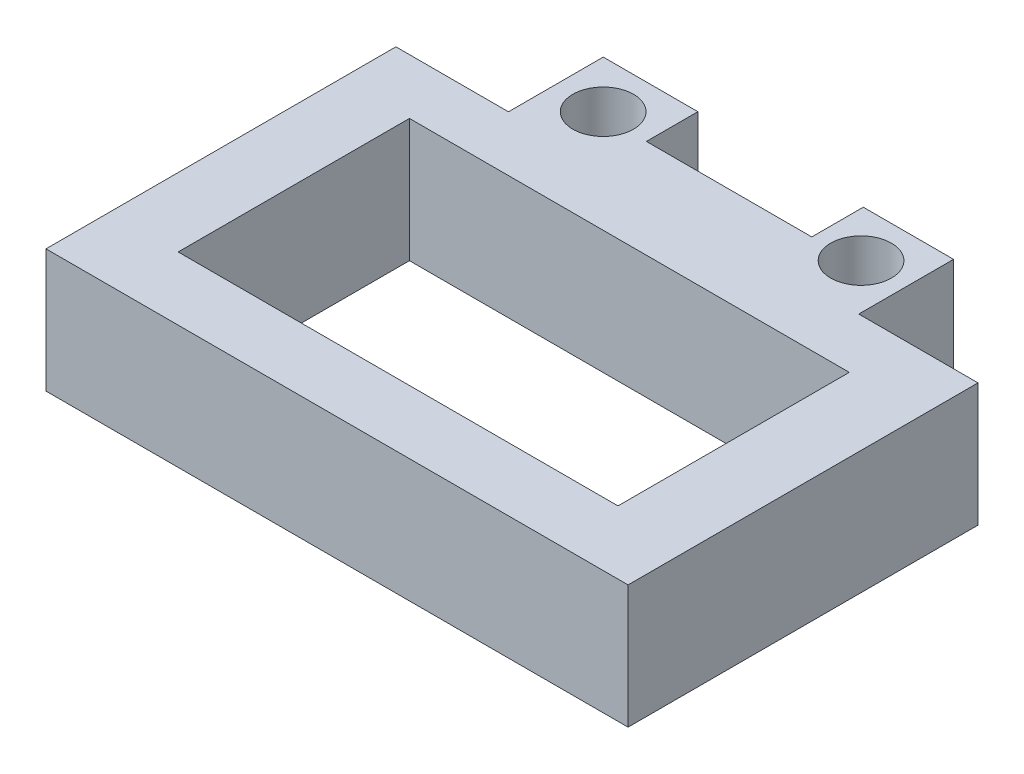
ISO-10303-21;
HEADER;
FILE_DESCRIPTION(('STEP AP214'),'2;1');
FILE_NAME('part.step','',(''),(''),'','','');
FILE_SCHEMA(('AUTOMOTIVE_DESIGN { 1 0 10303 214 1 1 1 1 }'));
ENDSEC;
DATA;
#1=APPLICATION_CONTEXT('core data for automotive mechanical design processes');
#2=APPLICATION_PROTOCOL_DEFINITION('international standard','automotive_design',2000,#1);
#3=PRODUCT_CONTEXT('',#1,'mechanical');
#4=PRODUCT('Part','Part','',(#3));
#5=PRODUCT_RELATED_PRODUCT_CATEGORY('part','',(#4));
#6=PRODUCT_DEFINITION_FORMATION('','',#4);
#7=PRODUCT_DEFINITION_CONTEXT('part definition',#1,'design');
#8=PRODUCT_DEFINITION('design','',#6,#7);
#9=PRODUCT_DEFINITION_SHAPE('','',#8);
#10=(LENGTH_UNIT() NAMED_UNIT(*) SI_UNIT(.MILLI.,.METRE.));
#11=(NAMED_UNIT(*) PLANE_ANGLE_UNIT() SI_UNIT($,.RADIAN.));
#12=(NAMED_UNIT(*) SI_UNIT($,.STERADIAN.) SOLID_ANGLE_UNIT());
#13=UNCERTAINTY_MEASURE_WITH_UNIT(LENGTH_MEASURE(1.E-05),#10,'distance_accuracy_value','');
#14=(GEOMETRIC_REPRESENTATION_CONTEXT(3) GLOBAL_UNCERTAINTY_ASSIGNED_CONTEXT((#13)) GLOBAL_UNIT_ASSIGNED_CONTEXT((#10,
#11,#12)) REPRESENTATION_CONTEXT('',''));
#15=CARTESIAN_POINT('',(0.,0.,0.));
#16=DIRECTION('',(0.,0.,1.));
#17=DIRECTION('',(1.,0.,0.));
#18=AXIS2_PLACEMENT_3D('',#15,#16,#17);
#19=CARTESIAN_POINT('',(0.,6.5,-27.7029443593856));
#20=DIRECTION('',(0.,0.,-1.));
#21=DIRECTION('',(-1.,0.,0.));
#22=AXIS2_PLACEMENT_3D('',#19,#20,#21);
#23=PLANE('',#22);
#24=DIRECTION('',(1.,0.,0.));
#25=VECTOR('',#24,1.);
#26=CARTESIAN_POINT('',(0.,0.,-27.7029443593856));
#27=LINE('',#26,#25);
#28=CARTESIAN_POINT('',(15.9084062557458,0.,-27.7029443593856));
#29=VERTEX_POINT('',#28);
#30=CARTESIAN_POINT('',(39.1084062557458,0.,-27.7029443593856));
#31=VERTEX_POINT('',#30);
#32=EDGE_CURVE('E249',#29,#31,#27,.T.);
#33=ORIENTED_EDGE('',*,*,#32,.T.);
#34=DIRECTION('',(0.,-1.,0.));
#35=VECTOR('',#34,1.);
#36=CARTESIAN_POINT('',(39.1084062557458,6.5,-27.7029443593856));
#37=LINE('',#36,#35);
#38=CARTESIAN_POINT('',(39.1084062557458,6.5,-27.7029443593856));
#39=VERTEX_POINT('',#38);
#40=EDGE_CURVE('E11',#39,#31,#37,.T.);
#41=ORIENTED_EDGE('',*,*,#40,.F.);
#42=DIRECTION('',(1.,0.,0.));
#43=VECTOR('',#42,1.);
#44=CARTESIAN_POINT('',(0.,6.5,-27.7029443593856));
#45=LINE('',#44,#43);
#46=CARTESIAN_POINT('',(15.9084062557458,6.5,-27.7029443593856));
#47=VERTEX_POINT('',#46);
#48=EDGE_CURVE('E176',#47,#39,#45,.T.);
#49=ORIENTED_EDGE('',*,*,#48,.F.);
#50=DIRECTION('',(0.,-1.,0.));
#51=VECTOR('',#50,1.);
#52=CARTESIAN_POINT('',(15.9084062557458,6.5,-27.7029443593856));
#53=LINE('',#52,#51);
#54=EDGE_CURVE('E67',#47,#29,#53,.T.);
#55=ORIENTED_EDGE('',*,*,#54,.T.);
#56=EDGE_LOOP('',(#33,#41,#49,#55));
#57=FACE_BOUND('',#56,.T.);
#58=ADVANCED_FACE('F47',(#57),#23,.F.);
#59=CARTESIAN_POINT('',(39.1084062557458,6.5,0.));
#60=DIRECTION('',(1.,0.,0.));
#61=DIRECTION('',(0.,0.,-1.));
#62=AXIS2_PLACEMENT_3D('',#59,#60,#61);
#63=PLANE('',#62);
#64=DIRECTION('',(0.,0.,1.));
#65=VECTOR('',#64,1.);
#66=CARTESIAN_POINT('',(39.1084062557458,0.,0.));
#67=LINE('',#66,#65);
#68=CARTESIAN_POINT('',(39.1084062557458,0.,-15.5029443593856));
#69=VERTEX_POINT('',#68);
#70=EDGE_CURVE('E183',#31,#69,#67,.T.);
#71=ORIENTED_EDGE('',*,*,#70,.T.);
#72=DIRECTION('',(0.,-1.,0.));
#73=VECTOR('',#72,1.);
#74=CARTESIAN_POINT('',(39.1084062557458,6.5,-15.5029443593856));
#75=LINE('',#74,#73);
#76=CARTESIAN_POINT('',(39.1084062557458,6.5,-15.5029443593856));
#77=VERTEX_POINT('',#76);
#78=EDGE_CURVE('E58',#77,#69,#75,.T.);
#79=ORIENTED_EDGE('',*,*,#78,.F.);
#80=DIRECTION('',(0.,0.,1.));
#81=VECTOR('',#80,1.);
#82=CARTESIAN_POINT('',(39.1084062557458,6.5,0.));
#83=LINE('',#82,#81);
#84=EDGE_CURVE('E169',#39,#77,#83,.T.);
#85=ORIENTED_EDGE('',*,*,#84,.F.);
#86=ORIENTED_EDGE('',*,*,#40,.T.);
#87=EDGE_LOOP('',(#71,#79,#85,#86));
#88=FACE_BOUND('',#87,.T.);
#89=ADVANCED_FACE('F182',(#88),#63,.F.);
#90=CARTESIAN_POINT('',(0.,6.5,-15.5029443593856));
#91=DIRECTION('',(0.,0.,-1.));
#92=DIRECTION('',(-1.,0.,0.));
#93=AXIS2_PLACEMENT_3D('',#90,#91,#92);
#94=PLANE('',#93);
#95=DIRECTION('',(1.,0.,0.));
#96=VECTOR('',#95,1.);
#97=CARTESIAN_POINT('',(0.,0.,-15.5029443593856));
#98=LINE('',#97,#96);
#99=CARTESIAN_POINT('',(15.9084062557458,0.,-15.5029443593856));
#100=VERTEX_POINT('',#99);
#101=EDGE_CURVE('E254',#100,#69,#98,.T.);
#102=ORIENTED_EDGE('',*,*,#101,.F.);
#103=DIRECTION('',(0.,-1.,0.));
#104=VECTOR('',#103,1.);
#105=CARTESIAN_POINT('',(15.9084062557458,6.5,-15.5029443593856));
#106=LINE('',#105,#104);
#107=CARTESIAN_POINT('',(15.9084062557458,6.5,-15.5029443593856));
#108=VERTEX_POINT('',#107);
#109=EDGE_CURVE('E117',#108,#100,#106,.T.);
#110=ORIENTED_EDGE('',*,*,#109,.F.);
#111=DIRECTION('',(1.,0.,0.));
#112=VECTOR('',#111,1.);
#113=CARTESIAN_POINT('',(0.,6.5,-15.5029443593856));
#114=LINE('',#113,#112);
#115=EDGE_CURVE('E175',#108,#77,#114,.T.);
#116=ORIENTED_EDGE('',*,*,#115,.T.);
#117=ORIENTED_EDGE('',*,*,#78,.T.);
#118=EDGE_LOOP('',(#102,#110,#116,#117));
#119=FACE_BOUND('',#118,.T.);
#120=ADVANCED_FACE('F188',(#119),#94,.T.);
#121=CARTESIAN_POINT('',(42.9837060254586,6.5,0.));
#122=DIRECTION('',(1.,0.,0.));
#123=DIRECTION('',(0.,0.,-1.));
#124=AXIS2_PLACEMENT_3D('',#121,#122,#123);
#125=PLANE('',#124);
#126=DIRECTION('',(0.,0.,1.));
#127=VECTOR('',#126,1.);
#128=CARTESIAN_POINT('',(42.9837060254586,0.,0.));
#129=LINE('',#128,#127);
#130=CARTESIAN_POINT('',(42.9837060254586,0.,-30.6169789102809));
#131=VERTEX_POINT('',#130);
#132=CARTESIAN_POINT('',(42.9837060254586,0.,-12.1598904694109));
#133=VERTEX_POINT('',#132);
#134=EDGE_CURVE('E205',#131,#133,#129,.T.);
#135=ORIENTED_EDGE('',*,*,#134,.F.);
#136=DIRECTION('',(0.,-1.,0.));
#137=VECTOR('',#136,1.);
#138=CARTESIAN_POINT('',(42.9837060254586,6.5,-30.6169789102809));
#139=LINE('',#138,#137);
#140=CARTESIAN_POINT('',(42.9837060254586,6.5,-30.6169789102809));
#141=VERTEX_POINT('',#140);
#142=EDGE_CURVE('E51',#141,#131,#139,.T.);
#143=ORIENTED_EDGE('',*,*,#142,.F.);
#144=DIRECTION('',(0.,0.,1.));
#145=VECTOR('',#144,1.);
#146=CARTESIAN_POINT('',(42.9837060254586,6.5,0.));
#147=LINE('',#146,#145);
#148=CARTESIAN_POINT('',(42.9837060254586,6.5,-12.1598904694109));
#149=VERTEX_POINT('',#148);
#150=EDGE_CURVE('E269',#141,#149,#147,.T.);
#151=ORIENTED_EDGE('',*,*,#150,.T.);
#152=DIRECTION('',(0.,-1.,0.));
#153=VECTOR('',#152,1.);
#154=CARTESIAN_POINT('',(42.9837060254586,6.5,-12.1598904694109));
#155=LINE('',#154,#153);
#156=EDGE_CURVE('E204',#149,#133,#155,.T.);
#157=ORIENTED_EDGE('',*,*,#156,.T.);
#158=EDGE_LOOP('',(#135,#143,#151,#157));
#159=FACE_BOUND('',#158,.T.);
#160=ADVANCED_FACE('F49',(#159),#125,.T.);
#161=CARTESIAN_POINT('',(0.,6.5,-30.6169789102809));
#162=DIRECTION('',(0.,0.,-1.));
#163=DIRECTION('',(-1.,0.,0.));
#164=AXIS2_PLACEMENT_3D('',#161,#162,#163);
#165=PLANE('',#164);
#166=DIRECTION('',(1.,0.,0.));
#167=VECTOR('',#166,1.);
#168=CARTESIAN_POINT('',(0.,0.,-30.6169789102809));
#169=LINE('',#168,#167);
#170=CARTESIAN_POINT('',(36.6952804265742,0.,-30.6169789102809));
#171=VERTEX_POINT('',#170);
#172=EDGE_CURVE('E209',#171,#131,#169,.T.);
#173=ORIENTED_EDGE('',*,*,#172,.F.);
#174=DIRECTION('',(0.,-1.,0.));
#175=VECTOR('',#174,1.);
#176=CARTESIAN_POINT('',(36.6952804265742,6.5,-30.6169789102809));
#177=LINE('',#176,#175);
#178=CARTESIAN_POINT('',(36.6952804265742,6.5,-30.6169789102809));
#179=VERTEX_POINT('',#178);
#180=EDGE_CURVE('E303',#179,#171,#177,.T.);
#181=ORIENTED_EDGE('',*,*,#180,.F.);
#182=DIRECTION('',(1.,0.,0.));
#183=VECTOR('',#182,1.);
#184=CARTESIAN_POINT('',(0.,6.5,-30.6169789102809));
#185=LINE('',#184,#183);
#186=EDGE_CURVE('E314',#179,#141,#185,.T.);
#187=ORIENTED_EDGE('',*,*,#186,.T.);
#188=ORIENTED_EDGE('',*,*,#142,.T.);
#189=EDGE_LOOP('',(#173,#181,#187,#188));
#190=FACE_BOUND('',#189,.T.);
#191=ADVANCED_FACE('F312',(#190),#165,.T.);
#192=CARTESIAN_POINT('',(36.6952804265742,6.5,0.));
#193=DIRECTION('',(1.,0.,0.));
#194=DIRECTION('',(0.,0.,-1.));
#195=AXIS2_PLACEMENT_3D('',#192,#193,#194);
#196=PLANE('',#195);
#197=DIRECTION('',(0.,0.,1.));
#198=VECTOR('',#197,1.);
#199=CARTESIAN_POINT('',(36.6952804265742,0.,0.));
#200=LINE('',#199,#198);
#201=CARTESIAN_POINT('',(36.6952804265742,0.,-35.6169789102809));
#202=VERTEX_POINT('',#201);
#203=EDGE_CURVE('E213',#202,#171,#200,.T.);
#204=ORIENTED_EDGE('',*,*,#203,.F.);
#205=DIRECTION('',(0.,-1.,0.));
#206=VECTOR('',#205,1.);
#207=CARTESIAN_POINT('',(36.6952804265742,6.5,-35.6169789102809));
#208=LINE('',#207,#206);
#209=CARTESIAN_POINT('',(36.6952804265742,6.5,-35.6169789102809));
#210=VERTEX_POINT('',#209);
#211=EDGE_CURVE('E301',#210,#202,#208,.T.);
#212=ORIENTED_EDGE('',*,*,#211,.F.);
#213=DIRECTION('',(0.,0.,1.));
#214=VECTOR('',#213,1.);
#215=CARTESIAN_POINT('',(36.6952804265742,6.5,0.));
#216=LINE('',#215,#214);
#217=EDGE_CURVE('E323',#210,#179,#216,.T.);
#218=ORIENTED_EDGE('',*,*,#217,.T.);
#219=ORIENTED_EDGE('',*,*,#180,.T.);
#220=EDGE_LOOP('',(#204,#212,#218,#219));
#221=FACE_BOUND('',#220,.T.);
#222=ADVANCED_FACE('F321',(#221),#196,.T.);
#223=CARTESIAN_POINT('',(0.,6.5,-35.6169789102809));
#224=DIRECTION('',(0.,0.,-1.));
#225=DIRECTION('',(-1.,0.,0.));
#226=AXIS2_PLACEMENT_3D('',#223,#224,#225);
#227=PLANE('',#226);
#228=DIRECTION('',(1.,0.,0.));
#229=VECTOR('',#228,1.);
#230=CARTESIAN_POINT('',(0.,0.,-35.6169789102809));
#231=LINE('',#230,#229);
#232=CARTESIAN_POINT('',(31.9329508926292,0.,-35.6169789102809));
#233=VERTEX_POINT('',#232);
#234=EDGE_CURVE('E218',#233,#202,#231,.T.);
#235=ORIENTED_EDGE('',*,*,#234,.F.);
#236=DIRECTION('',(0.,-1.,0.));
#237=VECTOR('',#236,1.);
#238=CARTESIAN_POINT('',(31.9329508926292,6.5,-35.6169789102809));
#239=LINE('',#238,#237);
#240=CARTESIAN_POINT('',(31.9329508926292,6.5,-35.6169789102809));
#241=VERTEX_POINT('',#240);
#242=EDGE_CURVE('E298',#241,#233,#239,.T.);
#243=ORIENTED_EDGE('',*,*,#242,.F.);
#244=DIRECTION('',(1.,0.,0.));
#245=VECTOR('',#244,1.);
#246=CARTESIAN_POINT('',(0.,6.5,-35.6169789102809));
#247=LINE('',#246,#245);
#248=EDGE_CURVE('E329',#241,#210,#247,.T.);
#249=ORIENTED_EDGE('',*,*,#248,.T.);
#250=ORIENTED_EDGE('',*,*,#211,.T.);
#251=EDGE_LOOP('',(#235,#243,#249,#250));
#252=FACE_BOUND('',#251,.T.);
#253=ADVANCED_FACE('F333',(#252),#227,.T.);
#254=CARTESIAN_POINT('',(31.9329508926292,6.5,0.));
#255=DIRECTION('',(-1.,0.,0.));
#256=DIRECTION('',(0.,0.,1.));
#257=AXIS2_PLACEMENT_3D('',#254,#255,#256);
#258=PLANE('',#257);
#259=DIRECTION('',(0.,0.,-1.));
#260=VECTOR('',#259,1.);
#261=CARTESIAN_POINT('',(31.9329508926292,0.,0.));
#262=LINE('',#261,#260);
#263=CARTESIAN_POINT('',(31.9329508926292,0.,-32.9001041007174));
#264=VERTEX_POINT('',#263);
#265=EDGE_CURVE('E222',#264,#233,#262,.T.);
#266=ORIENTED_EDGE('',*,*,#265,.F.);
#267=DIRECTION('',(0.,-1.,0.));
#268=VECTOR('',#267,1.);
#269=CARTESIAN_POINT('',(31.9329508926292,6.5,-32.9001041007174));
#270=LINE('',#269,#268);
#271=CARTESIAN_POINT('',(31.9329508926292,6.5,-32.9001041007174));
#272=VERTEX_POINT('',#271);
#273=EDGE_CURVE('E295',#272,#264,#270,.T.);
#274=ORIENTED_EDGE('',*,*,#273,.F.);
#275=DIRECTION('',(0.,0.,-1.));
#276=VECTOR('',#275,1.);
#277=CARTESIAN_POINT('',(31.9329508926292,6.5,0.));
#278=LINE('',#277,#276);
#279=EDGE_CURVE('E335',#272,#241,#278,.T.);
#280=ORIENTED_EDGE('',*,*,#279,.T.);
#281=ORIENTED_EDGE('',*,*,#242,.T.);
#282=EDGE_LOOP('',(#266,#274,#280,#281));
#283=FACE_BOUND('',#282,.T.);
#284=ADVANCED_FACE('F400',(#283),#258,.T.);
#285=CARTESIAN_POINT('',(0.,6.5,-32.9001041007174));
#286=DIRECTION('',(0.,0.,-1.));
#287=DIRECTION('',(-1.,0.,0.));
#288=AXIS2_PLACEMENT_3D('',#285,#286,#287);
#289=PLANE('',#288);
#290=DIRECTION('',(1.,0.,0.));
#291=VECTOR('',#290,1.);
#292=CARTESIAN_POINT('',(0.,0.,-32.9001041007174));
#293=LINE('',#292,#291);
#294=CARTESIAN_POINT('',(23.2083631864421,0.,-32.9001041007174));
#295=VERTEX_POINT('',#294);
#296=EDGE_CURVE('E226',#295,#264,#293,.T.);
#297=ORIENTED_EDGE('',*,*,#296,.F.);
#298=DIRECTION('',(0.,-1.,0.));
#299=VECTOR('',#298,1.);
#300=CARTESIAN_POINT('',(23.2083631864421,6.5,-32.9001041007174));
#301=LINE('',#300,#299);
#302=CARTESIAN_POINT('',(23.2083631864421,6.5,-32.9001041007174));
#303=VERTEX_POINT('',#302);
#304=EDGE_CURVE('E292',#303,#295,#301,.T.);
#305=ORIENTED_EDGE('',*,*,#304,.F.);
#306=DIRECTION('',(1.,0.,0.));
#307=VECTOR('',#306,1.);
#308=CARTESIAN_POINT('',(0.,6.5,-32.9001041007174));
#309=LINE('',#308,#307);
#310=EDGE_CURVE('E338',#303,#272,#309,.T.);
#311=ORIENTED_EDGE('',*,*,#310,.T.);
#312=ORIENTED_EDGE('',*,*,#273,.T.);
#313=EDGE_LOOP('',(#297,#305,#311,#312));
#314=FACE_BOUND('',#313,.T.);
#315=ADVANCED_FACE('F397',(#314),#289,.T.);
#316=CARTESIAN_POINT('',(23.2083631864421,6.5,0.));
#317=DIRECTION('',(1.,0.,0.));
#318=DIRECTION('',(0.,0.,-1.));
#319=AXIS2_PLACEMENT_3D('',#316,#317,#318);
#320=PLANE('',#319);
#321=DIRECTION('',(0.,0.,1.));
#322=VECTOR('',#321,1.);
#323=CARTESIAN_POINT('',(23.2083631864421,0.,0.));
#324=LINE('',#323,#322);
#325=CARTESIAN_POINT('',(23.2083631864421,0.,-35.6169789102809));
#326=VERTEX_POINT('',#325);
#327=EDGE_CURVE('E230',#326,#295,#324,.T.);
#328=ORIENTED_EDGE('',*,*,#327,.F.);
#329=DIRECTION('',(0.,-1.,0.));
#330=VECTOR('',#329,1.);
#331=CARTESIAN_POINT('',(23.2083631864421,6.5,-35.6169789102809));
#332=LINE('',#331,#330);
#333=CARTESIAN_POINT('',(23.2083631864421,6.5,-35.6169789102809));
#334=VERTEX_POINT('',#333);
#335=EDGE_CURVE('E289',#334,#326,#332,.T.);
#336=ORIENTED_EDGE('',*,*,#335,.F.);
#337=DIRECTION('',(0.,0.,1.));
#338=VECTOR('',#337,1.);
#339=CARTESIAN_POINT('',(23.2083631864421,6.5,0.));
#340=LINE('',#339,#338);
#341=EDGE_CURVE('E345',#334,#303,#340,.T.);
#342=ORIENTED_EDGE('',*,*,#341,.T.);
#343=ORIENTED_EDGE('',*,*,#304,.T.);
#344=EDGE_LOOP('',(#328,#336,#342,#343));
#345=FACE_BOUND('',#344,.T.);
#346=ADVANCED_FACE('F393',(#345),#320,.T.);
#347=CARTESIAN_POINT('',(0.,6.5,-35.6169789102809));
#348=DIRECTION('',(0.,0.,-1.));
#349=DIRECTION('',(-1.,0.,0.));
#350=AXIS2_PLACEMENT_3D('',#347,#348,#349);
#351=PLANE('',#350);
#352=DIRECTION('',(1.,0.,0.));
#353=VECTOR('',#352,1.);
#354=CARTESIAN_POINT('',(0.,0.,-35.6169789102809));
#355=LINE('',#354,#353);
#356=CARTESIAN_POINT('',(18.2174418348678,0.,-35.6169789102809));
#357=VERTEX_POINT('',#356);
#358=EDGE_CURVE('E234',#357,#326,#355,.T.);
#359=ORIENTED_EDGE('',*,*,#358,.F.);
#360=DIRECTION('',(0.,-1.,0.));
#361=VECTOR('',#360,1.);
#362=CARTESIAN_POINT('',(18.2174418348678,6.5,-35.6169789102809));
#363=LINE('',#362,#361);
#364=CARTESIAN_POINT('',(18.2174418348678,6.5,-35.6169789102809));
#365=VERTEX_POINT('',#364);
#366=EDGE_CURVE('E286',#365,#357,#363,.T.);
#367=ORIENTED_EDGE('',*,*,#366,.F.);
#368=DIRECTION('',(1.,0.,0.));
#369=VECTOR('',#368,1.);
#370=CARTESIAN_POINT('',(0.,6.5,-35.6169789102809));
#371=LINE('',#370,#369);
#372=EDGE_CURVE('E349',#365,#334,#371,.T.);
#373=ORIENTED_EDGE('',*,*,#372,.T.);
#374=ORIENTED_EDGE('',*,*,#335,.T.);
#375=EDGE_LOOP('',(#359,#367,#373,#374));
#376=FACE_BOUND('',#375,.T.);
#377=ADVANCED_FACE('F388',(#376),#351,.T.);
#378=CARTESIAN_POINT('',(18.2174418348678,6.5,0.));
#379=DIRECTION('',(1.,0.,0.));
#380=DIRECTION('',(0.,0.,-1.));
#381=AXIS2_PLACEMENT_3D('',#378,#379,#380);
#382=PLANE('',#381);
#383=DIRECTION('',(0.,0.,1.));
#384=VECTOR('',#383,1.);
#385=CARTESIAN_POINT('',(18.2174418348678,0.,0.));
#386=LINE('',#385,#384);
#387=CARTESIAN_POINT('',(18.2174418348678,0.,-30.6169789102809));
#388=VERTEX_POINT('',#387);
#389=EDGE_CURVE('E238',#357,#388,#386,.T.);
#390=ORIENTED_EDGE('',*,*,#389,.T.);
#391=DIRECTION('',(0.,-1.,0.));
#392=VECTOR('',#391,1.);
#393=CARTESIAN_POINT('',(18.2174418348678,6.5,-30.6169789102809));
#394=LINE('',#393,#392);
#395=CARTESIAN_POINT('',(18.2174418348678,6.5,-30.6169789102809));
#396=VERTEX_POINT('',#395);
#397=EDGE_CURVE('E283',#396,#388,#394,.T.);
#398=ORIENTED_EDGE('',*,*,#397,.F.);
#399=DIRECTION('',(0.,0.,1.));
#400=VECTOR('',#399,1.);
#401=CARTESIAN_POINT('',(18.2174418348678,6.5,0.));
#402=LINE('',#401,#400);
#403=EDGE_CURVE('E353',#365,#396,#402,.T.);
#404=ORIENTED_EDGE('',*,*,#403,.F.);
#405=ORIENTED_EDGE('',*,*,#366,.T.);
#406=EDGE_LOOP('',(#390,#398,#404,#405));
#407=FACE_BOUND('',#406,.T.);
#408=ADVANCED_FACE('F385',(#407),#382,.F.);
#409=CARTESIAN_POINT('',(12.2810376549901,0.,-30.6169789102809));
#410=VERTEX_POINT('',#409);
#411=EDGE_CURVE('E214',#410,#388,#169,.T.);
#412=ORIENTED_EDGE('',*,*,#411,.F.);
#413=DIRECTION('',(0.,-1.,0.));
#414=VECTOR('',#413,1.);
#415=CARTESIAN_POINT('',(12.2810376549901,6.5,-30.6169789102809));
#416=LINE('',#415,#414);
#417=CARTESIAN_POINT('',(12.2810376549901,6.5,-30.6169789102809));
#418=VERTEX_POINT('',#417);
#419=EDGE_CURVE('E280',#418,#410,#416,.T.);
#420=ORIENTED_EDGE('',*,*,#419,.F.);
#421=EDGE_CURVE('E356',#418,#396,#185,.T.);
#422=ORIENTED_EDGE('',*,*,#421,.T.);
#423=ORIENTED_EDGE('',*,*,#397,.T.);
#424=EDGE_LOOP('',(#412,#420,#422,#423));
#425=FACE_BOUND('',#424,.T.);
#426=ADVANCED_FACE('F380',(#425),#165,.T.);
#427=CARTESIAN_POINT('',(12.2810376549901,6.5,0.));
#428=DIRECTION('',(1.,0.,0.));
#429=DIRECTION('',(0.,0.,-1.));
#430=AXIS2_PLACEMENT_3D('',#427,#428,#429);
#431=PLANE('',#430);
#432=DIRECTION('',(0.,0.,1.));
#433=VECTOR('',#432,1.);
#434=CARTESIAN_POINT('',(12.2810376549901,0.,0.));
#435=LINE('',#434,#433);
#436=CARTESIAN_POINT('',(12.2810376549901,0.,-12.1598904694109));
#437=VERTEX_POINT('',#436);
#438=EDGE_CURVE('E242',#410,#437,#435,.T.);
#439=ORIENTED_EDGE('',*,*,#438,.T.);
#440=DIRECTION('',(0.,-1.,0.));
#441=VECTOR('',#440,1.);
#442=CARTESIAN_POINT('',(12.2810376549901,6.5,-12.1598904694109));
#443=LINE('',#442,#441);
#444=CARTESIAN_POINT('',(12.2810376549901,6.5,-12.1598904694109));
#445=VERTEX_POINT('',#444);
#446=EDGE_CURVE('E276',#445,#437,#443,.T.);
#447=ORIENTED_EDGE('',*,*,#446,.F.);
#448=DIRECTION('',(0.,0.,1.));
#449=VECTOR('',#448,1.);
#450=CARTESIAN_POINT('',(12.2810376549901,6.5,0.));
#451=LINE('',#450,#449);
#452=EDGE_CURVE('E357',#418,#445,#451,.T.);
#453=ORIENTED_EDGE('',*,*,#452,.F.);
#454=ORIENTED_EDGE('',*,*,#419,.T.);
#455=EDGE_LOOP('',(#439,#447,#453,#454));
#456=FACE_BOUND('',#455,.T.);
#457=ADVANCED_FACE('F421',(#456),#431,.F.);
#458=CARTESIAN_POINT('',(34.3141156596017,6.5,-33.1169789102809));
#459=DIRECTION('',(0.,-1.,0.));
#460=DIRECTION('',(0.,0.,-1.));
#461=AXIS2_PLACEMENT_3D('',#458,#459,#460);
#462=CYLINDRICAL_SURFACE('',#461,1.6);
#463=CARTESIAN_POINT('',(34.3141156596017,6.5,-33.1169789102809));
#464=DIRECTION('',(0.,1.,0.));
#465=DIRECTION('',(0.,0.,1.));
#466=AXIS2_PLACEMENT_3D('',#463,#464,#465);
#467=CIRCLE('',#466,1.6);
#468=CARTESIAN_POINT('',(34.3141156596017,6.5,-34.7169789102809));
#469=VERTEX_POINT('',#468);
#470=EDGE_CURVE('E193',#469,#469,#467,.T.);
#471=CARTESIAN_POINT('',(34.3141156596017,0.,-33.1169789102809));
#472=DIRECTION('',(0.,1.,0.));
#473=DIRECTION('',(0.,0.,1.));
#474=AXIS2_PLACEMENT_3D('',#471,#472,#473);
#475=CIRCLE('',#474,1.6);
#476=CARTESIAN_POINT('',(34.3141156596017,0.,-34.7169789102809));
#477=VERTEX_POINT('',#476);
#478=EDGE_CURVE('E261',#477,#477,#475,.T.);
#479=CARTESIAN_POINT('',(34.3141156596017,6.5,-34.7169789102809));
#480=CARTESIAN_POINT('',(34.3141156596017,6.43229166666667,-34.7169789102809));
#481=CARTESIAN_POINT('',(34.3141156596017,6.36458333333333,-34.7169789102809));
#482=CARTESIAN_POINT('',(34.3141156596017,6.22916666666667,-34.7169789102809));
#483=CARTESIAN_POINT('',(34.3141156596017,6.16145833333333,-34.7169789102809));
#484=CARTESIAN_POINT('',(34.3141156596017,6.02604166666667,-34.7169789102809));
#485=CARTESIAN_POINT('',(34.3141156596017,5.95833333333333,-34.7169789102809));
#486=CARTESIAN_POINT('',(34.3141156596017,5.82291666666667,-34.7169789102809));
#487=CARTESIAN_POINT('',(34.3141156596017,5.75520833333333,-34.7169789102809));
#488=CARTESIAN_POINT('',(34.3141156596017,5.61979166666667,-34.7169789102809));
#489=CARTESIAN_POINT('',(34.3141156596017,5.55208333333333,-34.7169789102809));
#490=CARTESIAN_POINT('',(34.3141156596017,5.41666666666667,-34.7169789102809));
#491=CARTESIAN_POINT('',(34.3141156596017,5.34895833333333,-34.7169789102809));
#492=CARTESIAN_POINT('',(34.3141156596017,5.21354166666667,-34.7169789102809));
#493=CARTESIAN_POINT('',(34.3141156596017,5.14583333333333,-34.7169789102809));
#494=CARTESIAN_POINT('',(34.3141156596017,5.01041666666667,-34.7169789102809));
#495=CARTESIAN_POINT('',(34.3141156596017,4.94270833333333,-34.7169789102809));
#496=CARTESIAN_POINT('',(34.3141156596017,4.80729166666667,-34.7169789102809));
#497=CARTESIAN_POINT('',(34.3141156596017,4.73958333333333,-34.7169789102809));
#498=CARTESIAN_POINT('',(34.3141156596017,4.60416666666667,-34.7169789102809));
#499=CARTESIAN_POINT('',(34.3141156596017,4.53645833333333,-34.7169789102809));
#500=CARTESIAN_POINT('',(34.3141156596017,4.40104166666667,-34.7169789102809));
#501=CARTESIAN_POINT('',(34.3141156596017,4.33333333333333,-34.7169789102809));
#502=CARTESIAN_POINT('',(34.3141156596017,4.19791666666667,-34.7169789102809));
#503=CARTESIAN_POINT('',(34.3141156596017,4.13020833333333,-34.7169789102809));
#504=CARTESIAN_POINT('',(34.3141156596017,3.99479166666667,-34.7169789102809));
#505=CARTESIAN_POINT('',(34.3141156596017,3.92708333333333,-34.7169789102809));
#506=CARTESIAN_POINT('',(34.3141156596017,3.79166666666667,-34.7169789102809));
#507=CARTESIAN_POINT('',(34.3141156596017,3.72395833333333,-34.7169789102809));
#508=CARTESIAN_POINT('',(34.3141156596017,3.58854166666667,-34.7169789102809));
#509=CARTESIAN_POINT('',(34.3141156596017,3.52083333333333,-34.7169789102809));
#510=CARTESIAN_POINT('',(34.3141156596017,3.38541666666667,-34.7169789102809));
#511=CARTESIAN_POINT('',(34.3141156596017,3.31770833333333,-34.7169789102809));
#512=CARTESIAN_POINT('',(34.3141156596017,3.18229166666667,-34.7169789102809));
#513=CARTESIAN_POINT('',(34.3141156596017,3.11458333333333,-34.7169789102809));
#514=CARTESIAN_POINT('',(34.3141156596017,2.97916666666667,-34.7169789102809));
#515=CARTESIAN_POINT('',(34.3141156596017,2.91145833333333,-34.7169789102809));
#516=CARTESIAN_POINT('',(34.3141156596017,2.77604166666667,-34.7169789102809));
#517=CARTESIAN_POINT('',(34.3141156596017,2.70833333333333,-34.7169789102809));
#518=CARTESIAN_POINT('',(34.3141156596017,2.57291666666667,-34.7169789102809));
#519=CARTESIAN_POINT('',(34.3141156596017,2.50520833333333,-34.7169789102809));
#520=CARTESIAN_POINT('',(34.3141156596017,2.36979166666667,-34.7169789102809));
#521=CARTESIAN_POINT('',(34.3141156596017,2.30208333333333,-34.7169789102809));
#522=CARTESIAN_POINT('',(34.3141156596017,2.16666666666667,-34.7169789102809));
#523=CARTESIAN_POINT('',(34.3141156596017,2.09895833333333,-34.7169789102809));
#524=CARTESIAN_POINT('',(34.3141156596017,1.96354166666667,-34.7169789102809));
#525=CARTESIAN_POINT('',(34.3141156596017,1.89583333333333,-34.7169789102809));
#526=CARTESIAN_POINT('',(34.3141156596017,1.76041666666667,-34.7169789102809));
#527=CARTESIAN_POINT('',(34.3141156596017,1.69270833333333,-34.7169789102809));
#528=CARTESIAN_POINT('',(34.3141156596017,1.55729166666667,-34.7169789102809));
#529=CARTESIAN_POINT('',(34.3141156596017,1.48958333333333,-34.7169789102809));
#530=CARTESIAN_POINT('',(34.3141156596017,1.35416666666667,-34.7169789102809));
#531=CARTESIAN_POINT('',(34.3141156596017,1.28645833333333,-34.7169789102809));
#532=CARTESIAN_POINT('',(34.3141156596017,1.15104166666667,-34.7169789102809));
#533=CARTESIAN_POINT('',(34.3141156596017,1.08333333333333,-34.7169789102809));
#534=CARTESIAN_POINT('',(34.3141156596017,0.947916666666667,-34.7169789102809));
#535=CARTESIAN_POINT('',(34.3141156596017,0.880208333333333,-34.7169789102809));
#536=CARTESIAN_POINT('',(34.3141156596017,0.744791666666667,-34.7169789102809));
#537=CARTESIAN_POINT('',(34.3141156596017,0.677083333333333,-34.7169789102809));
#538=CARTESIAN_POINT('',(34.3141156596017,0.541666666666667,-34.7169789102809));
#539=CARTESIAN_POINT('',(34.3141156596017,0.473958333333333,-34.7169789102809));
#540=CARTESIAN_POINT('',(34.3141156596017,0.338541666666667,-34.7169789102809));
#541=CARTESIAN_POINT('',(34.3141156596017,0.270833333333334,-34.7169789102809));
#542=CARTESIAN_POINT('',(34.3141156596017,0.135416666666667,-34.7169789102809));
#543=CARTESIAN_POINT('',(34.3141156596017,0.0677083333333334,-34.7169789102809));
#544=CARTESIAN_POINT('',(34.3141156596017,0.,-34.7169789102809));
#545=B_SPLINE_CURVE_WITH_KNOTS('',3,(#479,#480,#481,#482,#483,#484,#485,#486,#487,#488,#489,
#490,#491,#492,#493,#494,#495,#496,#497,#498,#499,#500,#501,#502,#503,#504,#505,#506,#507,#508,
#509,#510,#511,#512,#513,#514,#515,#516,#517,#518,#519,#520,#521,#522,#523,#524,#525,#526,#527,
#528,#529,#530,#531,#532,#533,#534,#535,#536,#537,#538,#539,#540,#541,#542,#543,#544),
.UNSPECIFIED.,.F.,.F.,(4,2,2,2,2,2,2,2,2,2,2,2,2,2,2,2,2,2,2,2,2,2,2,2,2,2,2,2,2,2,2,2,4),(0.,
0.203125,0.40625,0.609375000000001,0.812500000000001,1.015625,1.21875,1.421875,1.625,1.828125,
2.03125,2.234375,2.4375,2.640625,2.84375,3.046875,3.25,3.453125,3.65625,3.859375,4.0625,
4.265625,4.46875,4.671875,4.875,5.078125,5.28125,5.484375,5.6875,5.890625,6.09375,6.296875,6.5),.UNSPECIFIED.);
#546=EDGE_CURVE('BSEAM424',#469,#477,#545,.T.);
#547=ORIENTED_EDGE('',*,*,#470,.T.);
#548=ORIENTED_EDGE('',*,*,#478,.F.);
#549=ORIENTED_EDGE('',*,*,#546,.T.);
#550=ORIENTED_EDGE('',*,*,#546,.F.);
#551=EDGE_LOOP('',(#547,#549,#548,#550));
#552=FACE_BOUND('',#551,.T.);
#553=ADVANCED_FACE('F424',(#552),#462,.F.);
#554=CARTESIAN_POINT('',(15.9084062557458,6.5,0.));
#555=DIRECTION('',(1.,0.,0.));
#556=DIRECTION('',(0.,0.,-1.));
#557=AXIS2_PLACEMENT_3D('',#554,#555,#556);
#558=PLANE('',#557);
#559=DIRECTION('',(0.,0.,1.));
#560=VECTOR('',#559,1.);
#561=CARTESIAN_POINT('',(15.9084062557458,0.,0.));
#562=LINE('',#561,#560);
#563=EDGE_CURVE('E257',#29,#100,#562,.T.);
#564=ORIENTED_EDGE('',*,*,#563,.F.);
#565=ORIENTED_EDGE('',*,*,#54,.F.);
#566=DIRECTION('',(0.,0.,1.));
#567=VECTOR('',#566,1.);
#568=CARTESIAN_POINT('',(15.9084062557458,6.5,0.));
#569=LINE('',#568,#567);
#570=EDGE_CURVE('E190',#47,#108,#569,.T.);
#571=ORIENTED_EDGE('',*,*,#570,.T.);
#572=ORIENTED_EDGE('',*,*,#109,.T.);
#573=EDGE_LOOP('',(#564,#565,#571,#572));
#574=FACE_BOUND('',#573,.T.);
#575=ADVANCED_FACE('F420',(#574),#558,.T.);
#576=CARTESIAN_POINT('',(0.,6.5,-12.1598904694109));
#577=DIRECTION('',(0.,0.,-1.));
#578=DIRECTION('',(-1.,0.,0.));
#579=AXIS2_PLACEMENT_3D('',#576,#577,#578);
#580=PLANE('',#579);
#581=DIRECTION('',(1.,0.,0.));
#582=VECTOR('',#581,1.);
#583=CARTESIAN_POINT('',(0.,0.,-12.1598904694109));
#584=LINE('',#583,#582);
#585=EDGE_CURVE('E245',#437,#133,#584,.T.);
#586=ORIENTED_EDGE('',*,*,#585,.T.);
#587=ORIENTED_EDGE('',*,*,#156,.F.);
#588=DIRECTION('',(1.,0.,0.));
#589=VECTOR('',#588,1.);
#590=CARTESIAN_POINT('',(0.,6.5,-12.1598904694109));
#591=LINE('',#590,#589);
#592=EDGE_CURVE('E360',#445,#149,#591,.T.);
#593=ORIENTED_EDGE('',*,*,#592,.F.);
#594=ORIENTED_EDGE('',*,*,#446,.T.);
#595=EDGE_LOOP('',(#586,#587,#593,#594));
#596=FACE_BOUND('',#595,.T.);
#597=ADVANCED_FACE('F374',(#596),#580,.F.);
#598=CARTESIAN_POINT('',(20.7129025106549,6.5,-33.1169789102809));
#599=DIRECTION('',(0.,-1.,0.));
#600=DIRECTION('',(0.,0.,-1.));
#601=AXIS2_PLACEMENT_3D('',#598,#599,#600);
#602=CYLINDRICAL_SURFACE('',#601,1.6);
#603=CARTESIAN_POINT('',(20.7129025106549,6.5,-33.1169789102809));
#604=DIRECTION('',(0.,1.,0.));
#605=DIRECTION('',(0.,0.,1.));
#606=AXIS2_PLACEMENT_3D('',#603,#604,#605);
#607=CIRCLE('',#606,1.6);
#608=CARTESIAN_POINT('',(20.7129025106549,6.5,-34.7169789102809));
#609=VERTEX_POINT('',#608);
#610=EDGE_CURVE('E200',#609,#609,#607,.T.);
#611=CARTESIAN_POINT('',(20.7129025106549,0.,-33.1169789102809));
#612=DIRECTION('',(0.,1.,0.));
#613=DIRECTION('',(0.,0.,1.));
#614=AXIS2_PLACEMENT_3D('',#611,#612,#613);
#615=CIRCLE('',#614,1.6);
#616=CARTESIAN_POINT('',(20.7129025106549,0.,-34.7169789102809));
#617=VERTEX_POINT('',#616);
#618=EDGE_CURVE('E265',#617,#617,#615,.T.);
#619=CARTESIAN_POINT('',(20.7129025106549,6.5,-34.7169789102809));
#620=CARTESIAN_POINT('',(20.7129025106549,6.43229166666667,-34.7169789102809));
#621=CARTESIAN_POINT('',(20.7129025106549,6.36458333333333,-34.7169789102809));
#622=CARTESIAN_POINT('',(20.7129025106549,6.22916666666667,-34.7169789102809));
#623=CARTESIAN_POINT('',(20.7129025106549,6.16145833333333,-34.7169789102809));
#624=CARTESIAN_POINT('',(20.7129025106549,6.02604166666667,-34.7169789102809));
#625=CARTESIAN_POINT('',(20.7129025106549,5.95833333333333,-34.7169789102809));
#626=CARTESIAN_POINT('',(20.7129025106549,5.82291666666667,-34.7169789102809));
#627=CARTESIAN_POINT('',(20.7129025106549,5.75520833333333,-34.7169789102809));
#628=CARTESIAN_POINT('',(20.7129025106549,5.61979166666667,-34.7169789102809));
#629=CARTESIAN_POINT('',(20.7129025106549,5.55208333333333,-34.7169789102809));
#630=CARTESIAN_POINT('',(20.7129025106549,5.41666666666667,-34.7169789102809));
#631=CARTESIAN_POINT('',(20.7129025106549,5.34895833333333,-34.7169789102809));
#632=CARTESIAN_POINT('',(20.7129025106549,5.21354166666667,-34.7169789102809));
#633=CARTESIAN_POINT('',(20.7129025106549,5.14583333333333,-34.7169789102809));
#634=CARTESIAN_POINT('',(20.7129025106549,5.01041666666667,-34.7169789102809));
#635=CARTESIAN_POINT('',(20.7129025106549,4.94270833333333,-34.7169789102809));
#636=CARTESIAN_POINT('',(20.7129025106549,4.80729166666667,-34.7169789102809));
#637=CARTESIAN_POINT('',(20.7129025106549,4.73958333333333,-34.7169789102809));
#638=CARTESIAN_POINT('',(20.7129025106549,4.60416666666667,-34.7169789102809));
#639=CARTESIAN_POINT('',(20.7129025106549,4.53645833333333,-34.7169789102809));
#640=CARTESIAN_POINT('',(20.7129025106549,4.40104166666667,-34.7169789102809));
#641=CARTESIAN_POINT('',(20.7129025106549,4.33333333333333,-34.7169789102809));
#642=CARTESIAN_POINT('',(20.7129025106549,4.19791666666667,-34.7169789102809));
#643=CARTESIAN_POINT('',(20.7129025106549,4.13020833333333,-34.7169789102809));
#644=CARTESIAN_POINT('',(20.7129025106549,3.99479166666667,-34.7169789102809));
#645=CARTESIAN_POINT('',(20.7129025106549,3.92708333333333,-34.7169789102809));
#646=CARTESIAN_POINT('',(20.7129025106549,3.79166666666667,-34.7169789102809));
#647=CARTESIAN_POINT('',(20.7129025106549,3.72395833333333,-34.7169789102809));
#648=CARTESIAN_POINT('',(20.7129025106549,3.58854166666667,-34.7169789102809));
#649=CARTESIAN_POINT('',(20.7129025106549,3.52083333333333,-34.7169789102809));
#650=CARTESIAN_POINT('',(20.7129025106549,3.38541666666667,-34.7169789102809));
#651=CARTESIAN_POINT('',(20.7129025106549,3.31770833333333,-34.7169789102809));
#652=CARTESIAN_POINT('',(20.7129025106549,3.18229166666667,-34.7169789102809));
#653=CARTESIAN_POINT('',(20.7129025106549,3.11458333333333,-34.7169789102809));
#654=CARTESIAN_POINT('',(20.7129025106549,2.97916666666667,-34.7169789102809));
#655=CARTESIAN_POINT('',(20.7129025106549,2.91145833333333,-34.7169789102809));
#656=CARTESIAN_POINT('',(20.7129025106549,2.77604166666667,-34.7169789102809));
#657=CARTESIAN_POINT('',(20.7129025106549,2.70833333333333,-34.7169789102809));
#658=CARTESIAN_POINT('',(20.7129025106549,2.57291666666667,-34.7169789102809));
#659=CARTESIAN_POINT('',(20.7129025106549,2.50520833333333,-34.7169789102809));
#660=CARTESIAN_POINT('',(20.7129025106549,2.36979166666667,-34.7169789102809));
#661=CARTESIAN_POINT('',(20.7129025106549,2.30208333333333,-34.7169789102809));
#662=CARTESIAN_POINT('',(20.7129025106549,2.16666666666667,-34.7169789102809));
#663=CARTESIAN_POINT('',(20.7129025106549,2.09895833333333,-34.7169789102809));
#664=CARTESIAN_POINT('',(20.7129025106549,1.96354166666667,-34.7169789102809));
#665=CARTESIAN_POINT('',(20.7129025106549,1.89583333333333,-34.7169789102809));
#666=CARTESIAN_POINT('',(20.7129025106549,1.76041666666667,-34.7169789102809));
#667=CARTESIAN_POINT('',(20.7129025106549,1.69270833333333,-34.7169789102809));
#668=CARTESIAN_POINT('',(20.7129025106549,1.55729166666667,-34.7169789102809));
#669=CARTESIAN_POINT('',(20.7129025106549,1.48958333333333,-34.7169789102809));
#670=CARTESIAN_POINT('',(20.7129025106549,1.35416666666667,-34.7169789102809));
#671=CARTESIAN_POINT('',(20.7129025106549,1.28645833333333,-34.7169789102809));
#672=CARTESIAN_POINT('',(20.7129025106549,1.15104166666667,-34.7169789102809));
#673=CARTESIAN_POINT('',(20.7129025106549,1.08333333333333,-34.7169789102809));
#674=CARTESIAN_POINT('',(20.7129025106549,0.947916666666667,-34.7169789102809));
#675=CARTESIAN_POINT('',(20.7129025106549,0.880208333333333,-34.7169789102809));
#676=CARTESIAN_POINT('',(20.7129025106549,0.744791666666667,-34.7169789102809));
#677=CARTESIAN_POINT('',(20.7129025106549,0.677083333333333,-34.7169789102809));
#678=CARTESIAN_POINT('',(20.7129025106549,0.541666666666667,-34.7169789102809));
#679=CARTESIAN_POINT('',(20.7129025106549,0.473958333333333,-34.7169789102809));
#680=CARTESIAN_POINT('',(20.7129025106549,0.338541666666667,-34.7169789102809));
#681=CARTESIAN_POINT('',(20.7129025106549,0.270833333333334,-34.7169789102809));
#682=CARTESIAN_POINT('',(20.7129025106549,0.135416666666667,-34.7169789102809));
#683=CARTESIAN_POINT('',(20.7129025106549,0.0677083333333334,-34.7169789102809));
#684=CARTESIAN_POINT('',(20.7129025106549,0.,-34.7169789102809));
#685=B_SPLINE_CURVE_WITH_KNOTS('',3,(#619,#620,#621,#622,#623,#624,#625,#626,#627,#628,#629,
#630,#631,#632,#633,#634,#635,#636,#637,#638,#639,#640,#641,#642,#643,#644,#645,#646,#647,#648,
#649,#650,#651,#652,#653,#654,#655,#656,#657,#658,#659,#660,#661,#662,#663,#664,#665,#666,#667,
#668,#669,#670,#671,#672,#673,#674,#675,#676,#677,#678,#679,#680,#681,#682,#683,#684),
.UNSPECIFIED.,.F.,.F.,(4,2,2,2,2,2,2,2,2,2,2,2,2,2,2,2,2,2,2,2,2,2,2,2,2,2,2,2,2,2,2,2,4),(0.,
0.203125,0.40625,0.609375000000001,0.812500000000001,1.015625,1.21875,1.421875,1.625,1.828125,
2.03125,2.234375,2.4375,2.640625,2.84375,3.046875,3.25,3.453125,3.65625,3.859375,4.0625,
4.265625,4.46875,4.671875,4.875,5.078125,5.28125,5.484375,5.6875,5.890625,6.09375,6.296875,6.5),.UNSPECIFIED.);
#686=EDGE_CURVE('BSEAM419',#609,#617,#685,.T.);
#687=ORIENTED_EDGE('',*,*,#610,.T.);
#688=ORIENTED_EDGE('',*,*,#618,.F.);
#689=ORIENTED_EDGE('',*,*,#686,.T.);
#690=ORIENTED_EDGE('',*,*,#686,.F.);
#691=EDGE_LOOP('',(#687,#689,#688,#690));
#692=FACE_BOUND('',#691,.T.);
#693=ADVANCED_FACE('F419',(#692),#602,.F.);
#694=CARTESIAN_POINT('',(0.,6.5,0.));
#695=DIRECTION('',(0.,1.,0.));
#696=DIRECTION('',(0.,0.,1.));
#697=AXIS2_PLACEMENT_3D('',#694,#695,#696);
#698=PLANE('',#697);
#699=ORIENTED_EDGE('',*,*,#150,.F.);
#700=ORIENTED_EDGE('',*,*,#186,.F.);
#701=ORIENTED_EDGE('',*,*,#217,.F.);
#702=ORIENTED_EDGE('',*,*,#248,.F.);
#703=ORIENTED_EDGE('',*,*,#279,.F.);
#704=ORIENTED_EDGE('',*,*,#310,.F.);
#705=ORIENTED_EDGE('',*,*,#341,.F.);
#706=ORIENTED_EDGE('',*,*,#372,.F.);
#707=ORIENTED_EDGE('',*,*,#403,.T.);
#708=ORIENTED_EDGE('',*,*,#421,.F.);
#709=ORIENTED_EDGE('',*,*,#452,.T.);
#710=ORIENTED_EDGE('',*,*,#592,.T.);
#711=EDGE_LOOP('',(#699,#700,#701,#702,#703,#704,#705,#706,#707,#708,#709,#710));
#712=FACE_BOUND('',#711,.T.);
#713=ORIENTED_EDGE('',*,*,#48,.T.);
#714=ORIENTED_EDGE('',*,*,#84,.T.);
#715=ORIENTED_EDGE('',*,*,#115,.F.);
#716=ORIENTED_EDGE('',*,*,#570,.F.);
#717=EDGE_LOOP('',(#713,#714,#715,#716));
#718=FACE_BOUND('',#717,.T.);
#719=ORIENTED_EDGE('',*,*,#470,.F.);
#720=EDGE_LOOP('',(#719));
#721=FACE_BOUND('',#720,.T.);
#722=ORIENTED_EDGE('',*,*,#610,.F.);
#723=EDGE_LOOP('',(#722));
#724=FACE_BOUND('',#723,.T.);
#725=ADVANCED_FACE('F171',(#712,#718,#721,#724),#698,.T.);
#726=CARTESIAN_POINT('',(0.,0.,0.));
#727=DIRECTION('',(0.,1.,0.));
#728=DIRECTION('',(0.,0.,1.));
#729=AXIS2_PLACEMENT_3D('',#726,#727,#728);
#730=PLANE('',#729);
#731=ORIENTED_EDGE('',*,*,#134,.T.);
#732=ORIENTED_EDGE('',*,*,#585,.F.);
#733=ORIENTED_EDGE('',*,*,#438,.F.);
#734=ORIENTED_EDGE('',*,*,#411,.T.);
#735=ORIENTED_EDGE('',*,*,#389,.F.);
#736=ORIENTED_EDGE('',*,*,#358,.T.);
#737=ORIENTED_EDGE('',*,*,#327,.T.);
#738=ORIENTED_EDGE('',*,*,#296,.T.);
#739=ORIENTED_EDGE('',*,*,#265,.T.);
#740=ORIENTED_EDGE('',*,*,#234,.T.);
#741=ORIENTED_EDGE('',*,*,#203,.T.);
#742=ORIENTED_EDGE('',*,*,#172,.T.);
#743=EDGE_LOOP('',(#731,#732,#733,#734,#735,#736,#737,#738,#739,#740,#741,#742));
#744=FACE_BOUND('',#743,.T.);
#745=ORIENTED_EDGE('',*,*,#32,.F.);
#746=ORIENTED_EDGE('',*,*,#563,.T.);
#747=ORIENTED_EDGE('',*,*,#101,.T.);
#748=ORIENTED_EDGE('',*,*,#70,.F.);
#749=EDGE_LOOP('',(#745,#746,#747,#748));
#750=FACE_BOUND('',#749,.T.);
#751=ORIENTED_EDGE('',*,*,#478,.T.);
#752=EDGE_LOOP('',(#751));
#753=FACE_BOUND('',#752,.T.);
#754=ORIENTED_EDGE('',*,*,#618,.T.);
#755=EDGE_LOOP('',(#754));
#756=FACE_BOUND('',#755,.T.);
#757=ADVANCED_FACE('F318',(#744,#750,#753,#756),#730,.F.);
#758=CLOSED_SHELL('',(#58,#89,#120,#160,#191,#222,#253,#284,#315,#346,#377,#408,#426,#457,#553,
#575,#597,#693,#725,#757));
#759=MANIFOLD_SOLID_BREP('B2',#758);
#760=ADVANCED_BREP_SHAPE_REPRESENTATION('',(#18,#759),#14);
#761=SHAPE_DEFINITION_REPRESENTATION(#9,#760);
ENDSEC;
END-ISO-10303-21;
